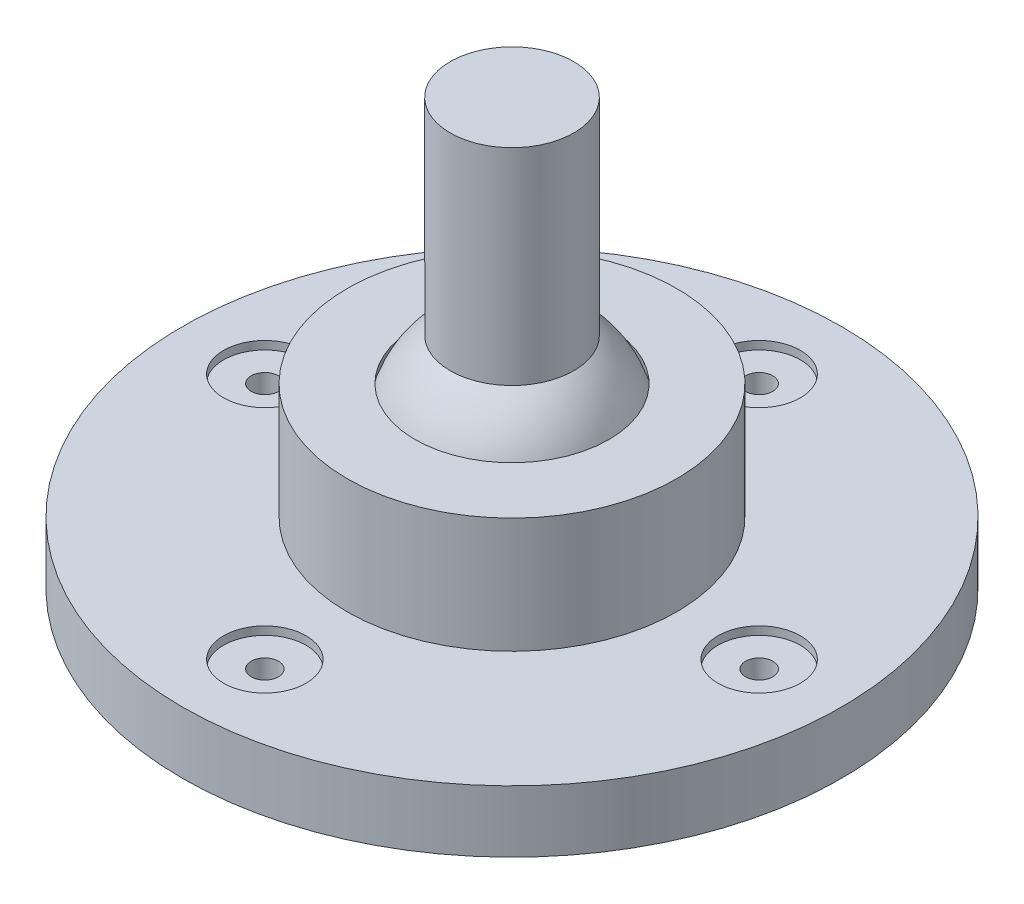
ISO-10303-21;
HEADER;
FILE_DESCRIPTION(('STEP AP214'),'2;1');
FILE_NAME('part.step','',(''),(''),'','','');
FILE_SCHEMA(('AUTOMOTIVE_DESIGN { 1 0 10303 214 1 1 1 1 }'));
ENDSEC;
DATA;
#1=APPLICATION_CONTEXT('core data for automotive mechanical design processes');
#2=APPLICATION_PROTOCOL_DEFINITION('international standard','automotive_design',2000,#1);
#3=PRODUCT_CONTEXT('',#1,'mechanical');
#4=PRODUCT('Part','Part','',(#3));
#5=PRODUCT_RELATED_PRODUCT_CATEGORY('part','',(#4));
#6=PRODUCT_DEFINITION_FORMATION('','',#4);
#7=PRODUCT_DEFINITION_CONTEXT('part definition',#1,'design');
#8=PRODUCT_DEFINITION('design','',#6,#7);
#9=PRODUCT_DEFINITION_SHAPE('','',#8);
#10=(LENGTH_UNIT() NAMED_UNIT(*) SI_UNIT(.MILLI.,.METRE.));
#11=(NAMED_UNIT(*) PLANE_ANGLE_UNIT() SI_UNIT($,.RADIAN.));
#12=(NAMED_UNIT(*) SI_UNIT($,.STERADIAN.) SOLID_ANGLE_UNIT());
#13=UNCERTAINTY_MEASURE_WITH_UNIT(LENGTH_MEASURE(1.E-05),#10,'distance_accuracy_value','');
#14=(GEOMETRIC_REPRESENTATION_CONTEXT(3) GLOBAL_UNCERTAINTY_ASSIGNED_CONTEXT((#13)) GLOBAL_UNIT_ASSIGNED_CONTEXT((#10,
#11,#12)) REPRESENTATION_CONTEXT('',''));
#15=CARTESIAN_POINT('',(0.,0.,0.));
#16=DIRECTION('',(0.,0.,1.));
#17=DIRECTION('',(1.,0.,0.));
#18=AXIS2_PLACEMENT_3D('',#15,#16,#17);
#19=CARTESIAN_POINT('',(0.,0.,0.));
#20=DIRECTION('',(0.,1.,0.));
#21=DIRECTION('',(0.,0.,1.));
#22=AXIS2_PLACEMENT_3D('',#19,#20,#21);
#23=CYLINDRICAL_SURFACE('',#22,40.);
#24=CARTESIAN_POINT('',(0.,9.80769230769231,0.));
#25=DIRECTION('',(0.,1.,0.));
#26=DIRECTION('',(0.,0.,1.));
#27=AXIS2_PLACEMENT_3D('',#24,#25,#26);
#28=CIRCLE('',#27,40.);
#29=CARTESIAN_POINT('',(0.,9.80769230769231,40.));
#30=VERTEX_POINT('',#29);
#31=EDGE_CURVE('E11',#30,#30,#28,.T.);
#32=ORIENTED_EDGE('',*,*,#31,.F.);
#33=EDGE_LOOP('',(#32));
#34=FACE_BOUND('',#33,.T.);
#35=CARTESIAN_POINT('',(0.,-18.1923076923077,0.));
#36=DIRECTION('',(0.,1.,0.));
#37=DIRECTION('',(0.,0.,1.));
#38=AXIS2_PLACEMENT_3D('',#35,#36,#37);
#39=CIRCLE('',#38,40.);
#40=CARTESIAN_POINT('',(0.,-18.1923076923077,40.));
#41=VERTEX_POINT('',#40);
#42=EDGE_CURVE('E81',#41,#41,#39,.T.);
#43=ORIENTED_EDGE('',*,*,#42,.T.);
#44=EDGE_LOOP('',(#43));
#45=FACE_BOUND('',#44,.T.);
#46=ADVANCED_FACE('F41',(#34,#45),#23,.T.);
#47=CARTESIAN_POINT('',(23.5384615384615,9.80769230769231,0.));
#48=DIRECTION('',(0.,-1.,0.));
#49=DIRECTION('',(0.,0.,-1.));
#50=AXIS2_PLACEMENT_3D('',#47,#48,#49);
#51=PLANE('',#50);
#52=CARTESIAN_POINT('',(0.,9.80769230769231,0.));
#53=DIRECTION('',(0.,1.,0.));
#54=DIRECTION('',(0.,0.,1.));
#55=AXIS2_PLACEMENT_3D('',#52,#53,#54);
#56=CIRCLE('',#55,23.5384615384615);
#57=CARTESIAN_POINT('',(23.5384615384615,9.80769230769231,0.));
#58=VERTEX_POINT('',#57);
#59=EDGE_CURVE('E48',#58,#58,#56,.T.);
#60=ORIENTED_EDGE('',*,*,#59,.F.);
#61=EDGE_LOOP('',(#60));
#62=FACE_BOUND('',#61,.T.);
#63=ORIENTED_EDGE('',*,*,#31,.T.);
#64=EDGE_LOOP('',(#63));
#65=FACE_BOUND('',#64,.T.);
#66=ADVANCED_FACE('F104',(#62,#65),#51,.F.);
#67=CARTESIAN_POINT('',(0.,0.,0.));
#68=DIRECTION('',(0.,1.,0.));
#69=DIRECTION('',(1.,0.,0.));
#70=AXIS2_PLACEMENT_3D('',#67,#68,#69);
#71=SPHERICAL_SURFACE('',#70,25.5);
#72=CARTESIAN_POINT('',(0.,-22.2261107708929,0.));
#73=DIRECTION('',(0.,1.,0.));
#74=DIRECTION('',(0.,0.,1.));
#75=AXIS2_PLACEMENT_3D('',#72,#73,#74);
#76=CIRCLE('',#75,12.5);
#77=CARTESIAN_POINT('',(12.5,-22.2261107708929,0.));
#78=VERTEX_POINT('',#77);
#79=EDGE_CURVE('E184',#78,#78,#76,.T.);
#80=CARTESIAN_POINT('',(12.5,-22.2261107708929,0.));
#81=CARTESIAN_POINT('',(12.8364680226437,-22.0368880617163,0.));
#82=CARTESIAN_POINT('',(13.1686324765588,-21.8400142664002,0.));
#83=CARTESIAN_POINT('',(13.8236843627591,-21.4313946735208,0.));
#84=CARTESIAN_POINT('',(14.1465717950442,-21.2196488759574,0.));
#85=CARTESIAN_POINT('',(14.7823997538119,-20.7817154486151,0.));
#86=CARTESIAN_POINT('',(15.0953402802943,-20.5555278188363,0.));
#87=CARTESIAN_POINT('',(15.7106301812919,-20.0891788958132,0.));
#88=CARTESIAN_POINT('',(16.0129795558071,-19.8490176025689,0.));
#89=CARTESIAN_POINT('',(16.6064633737054,-19.3552161352338,0.));
#90=CARTESIAN_POINT('',(16.8975978170886,-19.101575961143,0.));
#91=CARTESIAN_POINT('',(17.4680514884289,-18.5813399001619,0.));
#92=CARTESIAN_POINT('',(17.7473707163859,-18.3147440132717,0.));
#93=CARTESIAN_POINT('',(18.2936179386788,-17.7691462532377,0.));
#94=CARTESIAN_POINT('',(18.5605459330147,-17.4901443800939,0.));
#95=CARTESIAN_POINT('',(19.0814602488412,-16.9203099994274,0.));
#96=CARTESIAN_POINT('',(19.3354465703318,-16.6294774919048,0.));
#97=CARTESIAN_POINT('',(19.8299537817974,-16.0365815795143,0.));
#98=CARTESIAN_POINT('',(20.0704746717725,-15.7345181746464,0.));
#99=CARTESIAN_POINT('',(20.5375550311353,-15.1197833674038,0.));
#100=CARTESIAN_POINT('',(20.7641145005231,-14.807111965029,0.));
#101=CARTESIAN_POINT('',(21.2028048196355,-14.1718059370477,0.));
#102=CARTESIAN_POINT('',(21.41493566936,-13.8491713114413,0.));
#103=CARTESIAN_POINT('',(21.8243313041432,-13.194604157123,0.));
#104=CARTESIAN_POINT('',(22.0215960892018,-12.8626716284111,0.));
#105=CARTESIAN_POINT('',(22.4008528056273,-12.1901931615943,0.));
#106=CARTESIAN_POINT('',(22.5828447369941,-11.8496472234893,0.));
#107=CARTESIAN_POINT('',(22.9311804518918,-11.1606441937322,0.));
#108=CARTESIAN_POINT('',(23.0975242354226,-10.81218710208,0.));
#109=CARTESIAN_POINT('',(23.4142206292853,-10.1080803350327,0.));
#110=CARTESIAN_POINT('',(23.5645732396171,-9.75243065963775,0.));
#111=CARTESIAN_POINT('',(23.8489772378721,-9.03467212707681,0.));
#112=CARTESIAN_POINT('',(23.9830286257953,-8.67256326991086,0.));
#113=CARTESIAN_POINT('',(24.2345537455425,-7.94263309556298,0.));
#114=CARTESIAN_POINT('',(24.3520274773667,-7.57481177838105,0.));
#115=CARTESIAN_POINT('',(24.5701550367924,-6.83421518568943,0.));
#116=CARTESIAN_POINT('',(24.670808864394,-6.46143991017975,0.));
#117=CARTESIAN_POINT('',(24.8550890523686,-5.71170411831215,0.));
#118=CARTESIAN_POINT('',(24.9387154127417,-5.33474360195423,0.));
#119=CARTESIAN_POINT('',(25.0887682163979,-4.57741467645176,0.));
#120=CARTESIAN_POINT('',(25.155194659681,-4.19704626730721,0.));
#121=CARTESIAN_POINT('',(25.2707106480516,-3.43368593187128,0.));
#122=CARTESIAN_POINT('',(25.3198001931392,-3.05069400557989,0.));
#123=CARTESIAN_POINT('',(25.4005411552658,-2.28287642156219,0.));
#124=CARTESIAN_POINT('',(25.4321925723049,-1.89805076383587,0.));
#125=CARTESIAN_POINT('',(25.4779920084035,-1.12735928410791,0.));
#126=CARTESIAN_POINT('',(25.4921400274631,-0.741493462106276,0.));
#127=CARTESIAN_POINT('',(25.5029034924958,0.0304826341289916,0.));
#128=CARTESIAN_POINT('',(25.499518938469,0.416592908362621,0.));
#129=CARTESIAN_POINT('',(25.4752242360659,1.18826169259329,0.));
#130=CARTESIAN_POINT('',(25.4543140876895,1.57382020259032,0.));
#131=CARTESIAN_POINT('',(25.3950113190468,2.34359038092529,0.));
#132=CARTESIAN_POINT('',(25.3566186987804,2.72780204926322,0.));
#133=CARTESIAN_POINT('',(25.2624301476777,3.4940862396639,0.));
#134=CARTESIAN_POINT('',(25.2066342168414,3.87615876172667,0.));
#135=CARTESIAN_POINT('',(25.0777541410159,4.63737678328542,0.));
#136=CARTESIAN_POINT('',(25.0046699960266,5.01652228278141,0.));
#137=CARTESIAN_POINT('',(24.8413640640868,5.77110435508551,0.));
#138=CARTESIAN_POINT('',(24.7511422771362,6.14654092789362,0.));
#139=CARTESIAN_POINT('',(24.5537476271647,6.89293112908674,0.));
#140=CARTESIAN_POINT('',(24.4465747641439,7.26388475747176,0.));
#141=CARTESIAN_POINT('',(24.2154970451653,8.00054340822254,0.));
#142=CARTESIAN_POINT('',(24.0915921892075,8.3662484305883,0.));
#143=CARTESIAN_POINT('',(23.8273131714461,9.09165834647766,0.));
#144=CARTESIAN_POINT('',(23.6869390096425,9.45136324000125,0.));
#145=CARTESIAN_POINT('',(23.5384615384615,9.80769230769231,0.));
#146=B_SPLINE_CURVE_WITH_KNOTS('',3,(#80,#81,#82,#83,#84,#85,#86,#87,#88,#89,#90,#91,#92,#93,
#94,#95,#96,#97,#98,#99,#100,#101,#102,#103,#104,#105,#106,#107,#108,#109,#110,#111,#112,#113,
#114,#115,#116,#117,#118,#119,#120,#121,#122,#123,#124,#125,#126,#127,#128,#129,#130,#131,#132,
#133,#134,#135,#136,#137,#138,#139,#140,#141,#142,#143,#144,#145),.UNSPECIFIED.,.F.,.F.,(4,2,2,
2,2,2,2,2,2,2,2,2,2,2,2,2,2,2,2,2,2,2,2,2,2,2,2,2,2,2,2,2,4),(0.,1.15797720065555,
2.3159544013111,3.47393160196665,4.6319088026222,5.78988600327775,6.9478632039333,
8.10584040458885,9.2638176052444,10.4217948058999,11.5797720065555,12.737749207211,
13.8957264078666,15.0537036085221,16.2116808091777,17.3696580098333,18.5276352104888,
19.6856124111444,20.8435896117999,22.0015668124555,23.159544013111,24.3175212137665,
25.4754984144221,26.6334756150776,27.7914528157332,28.9494300163887,30.1074072170443,
31.2653844176998,32.4233616183554,33.5813388190109,34.7393160196665,35.897293220322,
37.0552704209776),.UNSPECIFIED.);
#147=EDGE_CURVE('BSEAM94',#78,#58,#146,.T.);
#148=ORIENTED_EDGE('',*,*,#79,.F.);
#149=ORIENTED_EDGE('',*,*,#59,.T.);
#150=ORIENTED_EDGE('',*,*,#147,.T.);
#151=ORIENTED_EDGE('',*,*,#147,.F.);
#152=EDGE_LOOP('',(#148,#150,#149,#151));
#153=FACE_BOUND('',#152,.T.);
#154=ADVANCED_FACE('F94',(#153),#71,.F.);
#155=CARTESIAN_POINT('',(0.,-33.1923076923077,0.));
#156=DIRECTION('',(0.,1.,0.));
#157=DIRECTION('',(0.,0.,1.));
#158=AXIS2_PLACEMENT_3D('',#155,#156,#157);
#159=PLANE('',#158);
#160=CARTESIAN_POINT('',(0.,-33.1923076923077,0.));
#161=DIRECTION('',(0.,-1.,0.));
#162=DIRECTION('',(0.,0.,-1.));
#163=AXIS2_PLACEMENT_3D('',#160,#161,#162);
#164=CIRCLE('',#163,12.5);
#165=CARTESIAN_POINT('',(0.,-33.1923076923077,-12.5));
#166=VERTEX_POINT('',#165);
#167=EDGE_CURVE('E181',#166,#166,#164,.T.);
#168=ORIENTED_EDGE('',*,*,#167,.F.);
#169=EDGE_LOOP('',(#168));
#170=FACE_BOUND('',#169,.T.);
#171=CARTESIAN_POINT('',(0.,-33.1923076923077,-60.));
#172=DIRECTION('',(0.,1.,0.));
#173=DIRECTION('',(0.,0.,1.));
#174=AXIS2_PLACEMENT_3D('',#171,#172,#173);
#175=CIRCLE('',#174,3.302);
#176=CARTESIAN_POINT('',(0.,-33.1923076923077,-56.698));
#177=VERTEX_POINT('',#176);
#178=EDGE_CURVE('E61',#177,#177,#175,.T.);
#179=ORIENTED_EDGE('',*,*,#178,.T.);
#180=EDGE_LOOP('',(#179));
#181=FACE_BOUND('',#180,.T.);
#182=CARTESIAN_POINT('',(60.0000000000017,-33.1923076923077,-1.69428074463191E-12));
#183=DIRECTION('',(0.,1.,0.));
#184=DIRECTION('',(0.,0.,1.));
#185=AXIS2_PLACEMENT_3D('',#182,#183,#184);
#186=CIRCLE('',#185,3.30200000000133);
#187=CARTESIAN_POINT('',(60.0000000000017,-33.1923076923077,3.30199999999963));
#188=VERTEX_POINT('',#187);
#189=EDGE_CURVE('E194',#188,#188,#186,.T.);
#190=ORIENTED_EDGE('',*,*,#189,.T.);
#191=EDGE_LOOP('',(#190));
#192=FACE_BOUND('',#191,.T.);
#193=CARTESIAN_POINT('',(3.38856148926383E-12,-33.1923076923077,60.));
#194=DIRECTION('',(0.,1.,0.));
#195=DIRECTION('',(0.,0.,1.));
#196=AXIS2_PLACEMENT_3D('',#193,#194,#195);
#197=CIRCLE('',#196,3.30200000000364);
#198=CARTESIAN_POINT('',(3.38856148926383E-12,-33.1923076923077,63.3020000000036));
#199=VERTEX_POINT('',#198);
#200=EDGE_CURVE('E188',#199,#199,#197,.T.);
#201=ORIENTED_EDGE('',*,*,#200,.T.);
#202=EDGE_LOOP('',(#201));
#203=FACE_BOUND('',#202,.T.);
#204=CARTESIAN_POINT('',(-59.9999999999983,-33.1923076923077,1.7016286254268E-12));
#205=DIRECTION('',(0.,1.,0.));
#206=DIRECTION('',(0.,0.,1.));
#207=AXIS2_PLACEMENT_3D('',#204,#205,#206);
#208=CIRCLE('',#207,3.30200000000273);
#209=CARTESIAN_POINT('',(-59.9999999999983,-33.1923076923077,3.30200000000443));
#210=VERTEX_POINT('',#209);
#211=EDGE_CURVE('E185',#210,#210,#208,.T.);
#212=ORIENTED_EDGE('',*,*,#211,.T.);
#213=EDGE_LOOP('',(#212));
#214=FACE_BOUND('',#213,.T.);
#215=CARTESIAN_POINT('',(0.,-33.1923076923077,0.));
#216=DIRECTION('',(0.,1.,0.));
#217=DIRECTION('',(0.,0.,1.));
#218=AXIS2_PLACEMENT_3D('',#215,#216,#217);
#219=CIRCLE('',#218,80.);
#220=CARTESIAN_POINT('',(0.,-33.1923076923077,80.));
#221=VERTEX_POINT('',#220);
#222=EDGE_CURVE('E53',#221,#221,#219,.T.);
#223=ORIENTED_EDGE('',*,*,#222,.F.);
#224=EDGE_LOOP('',(#223));
#225=FACE_BOUND('',#224,.T.);
#226=ADVANCED_FACE('F92',(#170,#181,#192,#203,#214,#225),#159,.F.);
#227=CARTESIAN_POINT('',(0.,0.,0.));
#228=DIRECTION('',(0.,1.,0.));
#229=DIRECTION('',(0.,0.,1.));
#230=AXIS2_PLACEMENT_3D('',#227,#228,#229);
#231=CYLINDRICAL_SURFACE('',#230,80.);
#232=CARTESIAN_POINT('',(0.,-18.1923076923077,0.));
#233=DIRECTION('',(0.,1.,0.));
#234=DIRECTION('',(0.,0.,1.));
#235=AXIS2_PLACEMENT_3D('',#232,#233,#234);
#236=CIRCLE('',#235,80.);
#237=CARTESIAN_POINT('',(0.,-18.1923076923077,80.));
#238=VERTEX_POINT('',#237);
#239=EDGE_CURVE('E84',#238,#238,#236,.T.);
#240=ORIENTED_EDGE('',*,*,#239,.F.);
#241=EDGE_LOOP('',(#240));
#242=FACE_BOUND('',#241,.T.);
#243=ORIENTED_EDGE('',*,*,#222,.T.);
#244=EDGE_LOOP('',(#243));
#245=FACE_BOUND('',#244,.T.);
#246=ADVANCED_FACE('F90',(#242,#245),#231,.T.);
#247=CARTESIAN_POINT('',(80.,-18.1923076923077,0.));
#248=DIRECTION('',(0.,-1.,0.));
#249=DIRECTION('',(0.,0.,-1.));
#250=AXIS2_PLACEMENT_3D('',#247,#248,#249);
#251=PLANE('',#250);
#252=CARTESIAN_POINT('',(0.,-18.1923076923077,-60.));
#253=DIRECTION('',(0.,1.,0.));
#254=DIRECTION('',(0.,0.,1.));
#255=AXIS2_PLACEMENT_3D('',#252,#253,#254);
#256=CIRCLE('',#255,10.);
#257=CARTESIAN_POINT('',(0.,-18.1923076923077,-50.));
#258=VERTEX_POINT('',#257);
#259=EDGE_CURVE('E201',#258,#258,#256,.T.);
#260=ORIENTED_EDGE('',*,*,#259,.F.);
#261=EDGE_LOOP('',(#260));
#262=FACE_BOUND('',#261,.T.);
#263=CARTESIAN_POINT('',(60.0000000000017,-18.1923076923077,-1.69428074463191E-12));
#264=DIRECTION('',(0.,1.,0.));
#265=DIRECTION('',(0.,0.,1.));
#266=AXIS2_PLACEMENT_3D('',#263,#264,#265);
#267=CIRCLE('',#266,10.0000000000013);
#268=CARTESIAN_POINT('',(60.0000000000017,-18.1923076923077,9.99999999999963));
#269=VERTEX_POINT('',#268);
#270=EDGE_CURVE('E207',#269,#269,#267,.T.);
#271=ORIENTED_EDGE('',*,*,#270,.F.);
#272=EDGE_LOOP('',(#271));
#273=FACE_BOUND('',#272,.T.);
#274=CARTESIAN_POINT('',(3.38856148926383E-12,-18.1923076923077,60.));
#275=DIRECTION('',(0.,1.,0.));
#276=DIRECTION('',(0.,0.,1.));
#277=AXIS2_PLACEMENT_3D('',#274,#275,#276);
#278=CIRCLE('',#277,10.0000000000036);
#279=CARTESIAN_POINT('',(3.38856148926383E-12,-18.1923076923077,70.0000000000036));
#280=VERTEX_POINT('',#279);
#281=EDGE_CURVE('E77',#280,#280,#278,.T.);
#282=ORIENTED_EDGE('',*,*,#281,.F.);
#283=EDGE_LOOP('',(#282));
#284=FACE_BOUND('',#283,.T.);
#285=CARTESIAN_POINT('',(-59.9999999999983,-18.1923076923077,1.7016286254268E-12));
#286=DIRECTION('',(0.,1.,0.));
#287=DIRECTION('',(0.,0.,1.));
#288=AXIS2_PLACEMENT_3D('',#285,#286,#287);
#289=CIRCLE('',#288,10.0000000000027);
#290=CARTESIAN_POINT('',(-59.9999999999983,-18.1923076923077,10.0000000000044));
#291=VERTEX_POINT('',#290);
#292=EDGE_CURVE('E68',#291,#291,#289,.T.);
#293=ORIENTED_EDGE('',*,*,#292,.F.);
#294=EDGE_LOOP('',(#293));
#295=FACE_BOUND('',#294,.T.);
#296=ORIENTED_EDGE('',*,*,#42,.F.);
#297=EDGE_LOOP('',(#296));
#298=FACE_BOUND('',#297,.T.);
#299=ORIENTED_EDGE('',*,*,#239,.T.);
#300=EDGE_LOOP('',(#299));
#301=FACE_BOUND('',#300,.T.);
#302=ADVANCED_FACE('F101',(#262,#273,#284,#295,#298,#301),#251,.F.);
#303=CARTESIAN_POINT('',(-59.9999999999983,-20.1923076923077,1.7016286254268E-12));
#304=DIRECTION('',(0.,1.,0.));
#305=DIRECTION('',(0.,0.,1.));
#306=AXIS2_PLACEMENT_3D('',#303,#304,#305);
#307=CYLINDRICAL_SURFACE('',#306,10.0000000000027);
#308=CARTESIAN_POINT('',(-59.9999999999983,-20.1923076923077,1.7016286254268E-12));
#309=DIRECTION('',(0.,1.,0.));
#310=DIRECTION('',(0.,0.,1.));
#311=AXIS2_PLACEMENT_3D('',#308,#309,#310);
#312=CIRCLE('',#311,10.0000000000027);
#313=CARTESIAN_POINT('',(-59.9999999999983,-20.1923076923077,10.0000000000044));
#314=VERTEX_POINT('',#313);
#315=EDGE_CURVE('E72',#314,#314,#312,.T.);
#316=ORIENTED_EDGE('',*,*,#315,.F.);
#317=EDGE_LOOP('',(#316));
#318=FACE_BOUND('',#317,.T.);
#319=ORIENTED_EDGE('',*,*,#292,.T.);
#320=EDGE_LOOP('',(#319));
#321=FACE_BOUND('',#320,.T.);
#322=ADVANCED_FACE('F120',(#318,#321),#307,.F.);
#323=CARTESIAN_POINT('',(-59.9999999999983,-20.1923076923077,1.7016286254268E-12));
#324=DIRECTION('',(0.,1.,0.));
#325=DIRECTION('',(0.,0.,1.));
#326=AXIS2_PLACEMENT_3D('',#323,#324,#325);
#327=PLANE('',#326);
#328=CARTESIAN_POINT('',(-59.9999999999983,-20.1923076923077,1.7016286254268E-12));
#329=DIRECTION('',(0.,1.,0.));
#330=DIRECTION('',(0.,0.,1.));
#331=AXIS2_PLACEMENT_3D('',#328,#329,#330);
#332=CIRCLE('',#331,3.30200000000273);
#333=CARTESIAN_POINT('',(-59.9999999999983,-20.1923076923077,3.30200000000443));
#334=VERTEX_POINT('',#333);
#335=EDGE_CURVE('E44',#334,#334,#332,.T.);
#336=ORIENTED_EDGE('',*,*,#335,.F.);
#337=EDGE_LOOP('',(#336));
#338=FACE_BOUND('',#337,.T.);
#339=ORIENTED_EDGE('',*,*,#315,.T.);
#340=EDGE_LOOP('',(#339));
#341=FACE_BOUND('',#340,.T.);
#342=ADVANCED_FACE('F127',(#338,#341),#327,.T.);
#343=CARTESIAN_POINT('',(3.38856148926383E-12,-20.1923076923077,60.));
#344=DIRECTION('',(0.,1.,0.));
#345=DIRECTION('',(0.,0.,1.));
#346=AXIS2_PLACEMENT_3D('',#343,#344,#345);
#347=CYLINDRICAL_SURFACE('',#346,10.0000000000036);
#348=CARTESIAN_POINT('',(3.38856148926383E-12,-20.1923076923077,60.));
#349=DIRECTION('',(0.,1.,0.));
#350=DIRECTION('',(0.,0.,1.));
#351=AXIS2_PLACEMENT_3D('',#348,#349,#350);
#352=CIRCLE('',#351,10.0000000000036);
#353=CARTESIAN_POINT('',(3.38856148926383E-12,-20.1923076923077,70.0000000000036));
#354=VERTEX_POINT('',#353);
#355=EDGE_CURVE('E210',#354,#354,#352,.T.);
#356=ORIENTED_EDGE('',*,*,#355,.F.);
#357=EDGE_LOOP('',(#356));
#358=FACE_BOUND('',#357,.T.);
#359=ORIENTED_EDGE('',*,*,#281,.T.);
#360=EDGE_LOOP('',(#359));
#361=FACE_BOUND('',#360,.T.);
#362=ADVANCED_FACE('F135',(#358,#361),#347,.F.);
#363=CARTESIAN_POINT('',(3.38856148926383E-12,-20.1923076923077,60.));
#364=DIRECTION('',(0.,1.,0.));
#365=DIRECTION('',(0.,0.,1.));
#366=AXIS2_PLACEMENT_3D('',#363,#364,#365);
#367=PLANE('',#366);
#368=CARTESIAN_POINT('',(3.38856148926383E-12,-20.1923076923077,60.));
#369=DIRECTION('',(0.,1.,0.));
#370=DIRECTION('',(0.,0.,1.));
#371=AXIS2_PLACEMENT_3D('',#368,#369,#370);
#372=CIRCLE('',#371,3.30200000000364);
#373=CARTESIAN_POINT('',(3.38856148926383E-12,-20.1923076923077,63.3020000000036));
#374=VERTEX_POINT('',#373);
#375=EDGE_CURVE('E63',#374,#374,#372,.T.);
#376=ORIENTED_EDGE('',*,*,#375,.F.);
#377=EDGE_LOOP('',(#376));
#378=FACE_BOUND('',#377,.T.);
#379=ORIENTED_EDGE('',*,*,#355,.T.);
#380=EDGE_LOOP('',(#379));
#381=FACE_BOUND('',#380,.T.);
#382=ADVANCED_FACE('F139',(#378,#381),#367,.T.);
#383=CARTESIAN_POINT('',(60.0000000000017,-20.1923076923077,-1.69428074463191E-12));
#384=DIRECTION('',(0.,1.,0.));
#385=DIRECTION('',(0.,0.,1.));
#386=AXIS2_PLACEMENT_3D('',#383,#384,#385);
#387=CYLINDRICAL_SURFACE('',#386,10.0000000000013);
#388=CARTESIAN_POINT('',(60.0000000000017,-20.1923076923077,-1.69428074463191E-12));
#389=DIRECTION('',(0.,1.,0.));
#390=DIRECTION('',(0.,0.,1.));
#391=AXIS2_PLACEMENT_3D('',#388,#389,#390);
#392=CIRCLE('',#391,10.0000000000013);
#393=CARTESIAN_POINT('',(60.0000000000017,-20.1923076923077,9.99999999999963));
#394=VERTEX_POINT('',#393);
#395=EDGE_CURVE('E204',#394,#394,#392,.T.);
#396=ORIENTED_EDGE('',*,*,#395,.F.);
#397=EDGE_LOOP('',(#396));
#398=FACE_BOUND('',#397,.T.);
#399=ORIENTED_EDGE('',*,*,#270,.T.);
#400=EDGE_LOOP('',(#399));
#401=FACE_BOUND('',#400,.T.);
#402=ADVANCED_FACE('F143',(#398,#401),#387,.F.);
#403=CARTESIAN_POINT('',(60.0000000000017,-20.1923076923077,-1.69428074463191E-12));
#404=DIRECTION('',(0.,1.,0.));
#405=DIRECTION('',(0.,0.,1.));
#406=AXIS2_PLACEMENT_3D('',#403,#404,#405);
#407=PLANE('',#406);
#408=CARTESIAN_POINT('',(60.0000000000017,-20.1923076923077,-1.69428074463191E-12));
#409=DIRECTION('',(0.,1.,0.));
#410=DIRECTION('',(0.,0.,1.));
#411=AXIS2_PLACEMENT_3D('',#408,#409,#410);
#412=CIRCLE('',#411,3.30200000000133);
#413=CARTESIAN_POINT('',(60.0000000000017,-20.1923076923077,3.30199999999963));
#414=VERTEX_POINT('',#413);
#415=EDGE_CURVE('E60',#414,#414,#412,.T.);
#416=ORIENTED_EDGE('',*,*,#415,.F.);
#417=EDGE_LOOP('',(#416));
#418=FACE_BOUND('',#417,.T.);
#419=ORIENTED_EDGE('',*,*,#395,.T.);
#420=EDGE_LOOP('',(#419));
#421=FACE_BOUND('',#420,.T.);
#422=ADVANCED_FACE('F147',(#418,#421),#407,.T.);
#423=CARTESIAN_POINT('',(0.,-20.1923076923077,-60.));
#424=DIRECTION('',(0.,1.,0.));
#425=DIRECTION('',(0.,0.,1.));
#426=AXIS2_PLACEMENT_3D('',#423,#424,#425);
#427=CYLINDRICAL_SURFACE('',#426,10.);
#428=CARTESIAN_POINT('',(0.,-20.1923076923077,-60.));
#429=DIRECTION('',(0.,1.,0.));
#430=DIRECTION('',(0.,0.,1.));
#431=AXIS2_PLACEMENT_3D('',#428,#429,#430);
#432=CIRCLE('',#431,10.);
#433=CARTESIAN_POINT('',(0.,-20.1923076923077,-50.));
#434=VERTEX_POINT('',#433);
#435=EDGE_CURVE('E85',#434,#434,#432,.T.);
#436=ORIENTED_EDGE('',*,*,#435,.F.);
#437=EDGE_LOOP('',(#436));
#438=FACE_BOUND('',#437,.T.);
#439=ORIENTED_EDGE('',*,*,#259,.T.);
#440=EDGE_LOOP('',(#439));
#441=FACE_BOUND('',#440,.T.);
#442=ADVANCED_FACE('F151',(#438,#441),#427,.F.);
#443=CARTESIAN_POINT('',(0.,-20.1923076923077,-60.));
#444=DIRECTION('',(0.,1.,0.));
#445=DIRECTION('',(0.,0.,1.));
#446=AXIS2_PLACEMENT_3D('',#443,#444,#445);
#447=PLANE('',#446);
#448=CARTESIAN_POINT('',(0.,-20.1923076923077,-60.));
#449=DIRECTION('',(0.,1.,0.));
#450=DIRECTION('',(0.,0.,1.));
#451=AXIS2_PLACEMENT_3D('',#448,#449,#450);
#452=CIRCLE('',#451,3.302);
#453=CARTESIAN_POINT('',(0.,-20.1923076923077,-56.698));
#454=VERTEX_POINT('',#453);
#455=EDGE_CURVE('E57',#454,#454,#452,.T.);
#456=ORIENTED_EDGE('',*,*,#455,.F.);
#457=EDGE_LOOP('',(#456));
#458=FACE_BOUND('',#457,.T.);
#459=ORIENTED_EDGE('',*,*,#435,.T.);
#460=EDGE_LOOP('',(#459));
#461=FACE_BOUND('',#460,.T.);
#462=ADVANCED_FACE('F155',(#458,#461),#447,.T.);
#463=CARTESIAN_POINT('',(0.,-33.1923076923077,-60.));
#464=DIRECTION('',(0.,1.,0.));
#465=DIRECTION('',(0.,0.,1.));
#466=AXIS2_PLACEMENT_3D('',#463,#464,#465);
#467=CYLINDRICAL_SURFACE('',#466,3.302);
#468=ORIENTED_EDGE('',*,*,#455,.T.);
#469=EDGE_LOOP('',(#468));
#470=FACE_BOUND('',#469,.T.);
#471=ORIENTED_EDGE('',*,*,#178,.F.);
#472=EDGE_LOOP('',(#471));
#473=FACE_BOUND('',#472,.T.);
#474=ADVANCED_FACE('F159',(#470,#473),#467,.F.);
#475=CARTESIAN_POINT('',(60.0000000000017,-33.1923076923077,-1.69428074463191E-12));
#476=DIRECTION('',(0.,1.,0.));
#477=DIRECTION('',(0.,0.,1.));
#478=AXIS2_PLACEMENT_3D('',#475,#476,#477);
#479=CYLINDRICAL_SURFACE('',#478,3.30200000000133);
#480=ORIENTED_EDGE('',*,*,#415,.T.);
#481=EDGE_LOOP('',(#480));
#482=FACE_BOUND('',#481,.T.);
#483=ORIENTED_EDGE('',*,*,#189,.F.);
#484=EDGE_LOOP('',(#483));
#485=FACE_BOUND('',#484,.T.);
#486=ADVANCED_FACE('F168',(#482,#485),#479,.F.);
#487=CARTESIAN_POINT('',(3.38856148926383E-12,-33.1923076923077,60.));
#488=DIRECTION('',(0.,1.,0.));
#489=DIRECTION('',(0.,0.,1.));
#490=AXIS2_PLACEMENT_3D('',#487,#488,#489);
#491=CYLINDRICAL_SURFACE('',#490,3.30200000000364);
#492=ORIENTED_EDGE('',*,*,#375,.T.);
#493=EDGE_LOOP('',(#492));
#494=FACE_BOUND('',#493,.T.);
#495=ORIENTED_EDGE('',*,*,#200,.F.);
#496=EDGE_LOOP('',(#495));
#497=FACE_BOUND('',#496,.T.);
#498=ADVANCED_FACE('F165',(#494,#497),#491,.F.);
#499=CARTESIAN_POINT('',(-59.9999999999983,-33.1923076923077,1.7016286254268E-12));
#500=DIRECTION('',(0.,1.,0.));
#501=DIRECTION('',(0.,0.,1.));
#502=AXIS2_PLACEMENT_3D('',#499,#500,#501);
#503=CYLINDRICAL_SURFACE('',#502,3.30200000000273);
#504=ORIENTED_EDGE('',*,*,#335,.T.);
#505=EDGE_LOOP('',(#504));
#506=FACE_BOUND('',#505,.T.);
#507=ORIENTED_EDGE('',*,*,#211,.F.);
#508=EDGE_LOOP('',(#507));
#509=FACE_BOUND('',#508,.T.);
#510=ADVANCED_FACE('F161',(#506,#509),#503,.F.);
#511=CARTESIAN_POINT('',(0.,70.001,0.));
#512=DIRECTION('',(0.,-1.,0.));
#513=DIRECTION('',(0.,0.,-1.));
#514=AXIS2_PLACEMENT_3D('',#511,#512,#513);
#515=CYLINDRICAL_SURFACE('',#514,12.5);
#516=ORIENTED_EDGE('',*,*,#167,.T.);
#517=EDGE_LOOP('',(#516));
#518=FACE_BOUND('',#517,.T.);
#519=ORIENTED_EDGE('',*,*,#79,.T.);
#520=EDGE_LOOP('',(#519));
#521=FACE_BOUND('',#520,.T.);
#522=ADVANCED_FACE('F164',(#518,#521),#515,.F.);
#523=CLOSED_SHELL('',(#46,#66,#154,#226,#246,#302,#322,#342,#362,#382,#402,#422,#442,#462,#474,
#486,#498,#510,#522));
#524=MANIFOLD_SOLID_BREP('B2',#523);
#525=CARTESIAN_POINT('',(0.,0.,0.));
#526=DIRECTION('',(0.,1.,0.));
#527=DIRECTION('',(-1.,0.,0.));
#528=AXIS2_PLACEMENT_3D('',#525,#526,#527);
#529=SPHERICAL_SURFACE('',#528,25.);
#530=CARTESIAN_POINT('',(0.,20.,0.));
#531=DIRECTION('',(0.,1.,0.));
#532=DIRECTION('',(0.,0.,1.));
#533=AXIS2_PLACEMENT_3D('',#530,#531,#532);
#534=CIRCLE('',#533,15.);
#535=CARTESIAN_POINT('',(0.,20.,15.));
#536=VERTEX_POINT('',#535);
#537=EDGE_CURVE('E40',#536,#536,#534,.T.);
#538=ORIENTED_EDGE('',*,*,#537,.F.);
#539=EDGE_LOOP('',(#538));
#540=FACE_BOUND('',#539,.T.);
#541=ADVANCED_FACE('F362',(#540),#529,.T.);
#542=CARTESIAN_POINT('',(0.,0.,0.));
#543=DIRECTION('',(0.,1.,0.));
#544=DIRECTION('',(0.,0.,1.));
#545=AXIS2_PLACEMENT_3D('',#542,#543,#544);
#546=CYLINDRICAL_SURFACE('',#545,15.);
#547=CARTESIAN_POINT('',(0.,70.,0.));
#548=DIRECTION('',(0.,1.,0.));
#549=DIRECTION('',(0.,0.,1.));
#550=AXIS2_PLACEMENT_3D('',#547,#548,#549);
#551=CIRCLE('',#550,15.);
#552=CARTESIAN_POINT('',(0.,70.,15.));
#553=VERTEX_POINT('',#552);
#554=EDGE_CURVE('E368',#553,#553,#551,.T.);
#555=ORIENTED_EDGE('',*,*,#554,.F.);
#556=EDGE_LOOP('',(#555));
#557=FACE_BOUND('',#556,.T.);
#558=ORIENTED_EDGE('',*,*,#537,.T.);
#559=EDGE_LOOP('',(#558));
#560=FACE_BOUND('',#559,.T.);
#561=ADVANCED_FACE('F376',(#557,#560),#546,.T.);
#562=CARTESIAN_POINT('',(0.,70.,0.));
#563=DIRECTION('',(0.,-1.,0.));
#564=DIRECTION('',(0.,0.,-1.));
#565=AXIS2_PLACEMENT_3D('',#562,#563,#564);
#566=PLANE('',#565);
#567=ORIENTED_EDGE('',*,*,#554,.T.);
#568=EDGE_LOOP('',(#567));
#569=FACE_BOUND('',#568,.T.);
#570=ADVANCED_FACE('F374',(#569),#566,.F.);
#571=CLOSED_SHELL('',(#541,#561,#570));
#572=MANIFOLD_SOLID_BREP('B6',#571);
#573=ADVANCED_BREP_SHAPE_REPRESENTATION('',(#18,#524,#572),#14);
#574=SHAPE_DEFINITION_REPRESENTATION(#9,#573);
ENDSEC;
END-ISO-10303-21;
